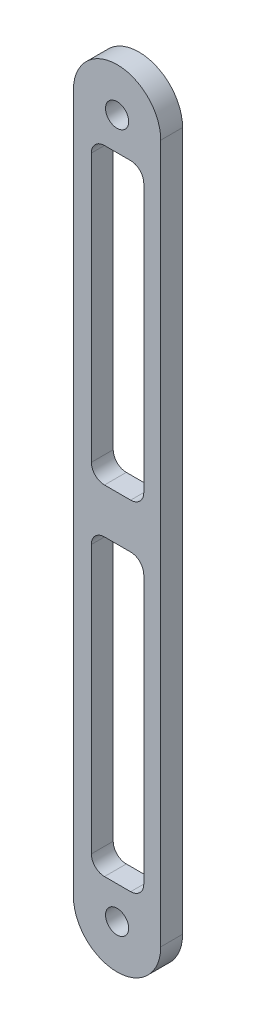
ISO-10303-21;
HEADER;
FILE_DESCRIPTION(('STEP AP214'),'2;1');
FILE_NAME('part.step','',(''),(''),'','','');
FILE_SCHEMA(('AUTOMOTIVE_DESIGN { 1 0 10303 214 1 1 1 1 }'));
ENDSEC;
DATA;
#1=APPLICATION_CONTEXT('core data for automotive mechanical design processes');
#2=APPLICATION_PROTOCOL_DEFINITION('international standard','automotive_design',2000,#1);
#3=PRODUCT_CONTEXT('',#1,'mechanical');
#4=PRODUCT('Part','Part','',(#3));
#5=PRODUCT_RELATED_PRODUCT_CATEGORY('part','',(#4));
#6=PRODUCT_DEFINITION_FORMATION('','',#4);
#7=PRODUCT_DEFINITION_CONTEXT('part definition',#1,'design');
#8=PRODUCT_DEFINITION('design','',#6,#7);
#9=PRODUCT_DEFINITION_SHAPE('','',#8);
#10=(LENGTH_UNIT() NAMED_UNIT(*) SI_UNIT(.MILLI.,.METRE.));
#11=(NAMED_UNIT(*) PLANE_ANGLE_UNIT() SI_UNIT($,.RADIAN.));
#12=(NAMED_UNIT(*) SI_UNIT($,.STERADIAN.) SOLID_ANGLE_UNIT());
#13=UNCERTAINTY_MEASURE_WITH_UNIT(LENGTH_MEASURE(1.E-05),#10,'distance_accuracy_value','');
#14=(GEOMETRIC_REPRESENTATION_CONTEXT(3) GLOBAL_UNCERTAINTY_ASSIGNED_CONTEXT((#13)) GLOBAL_UNIT_ASSIGNED_CONTEXT((#10,
#11,#12)) REPRESENTATION_CONTEXT('',''));
#15=CARTESIAN_POINT('',(0.,0.,0.));
#16=DIRECTION('',(0.,0.,1.));
#17=DIRECTION('',(1.,0.,0.));
#18=AXIS2_PLACEMENT_3D('',#15,#16,#17);
#19=CARTESIAN_POINT('',(0.,-80.,5.));
#20=DIRECTION('',(0.,0.,1.));
#21=DIRECTION('',(1.,0.,0.));
#22=AXIS2_PLACEMENT_3D('',#19,#20,#21);
#23=PLANE('',#22);
#24=CARTESIAN_POINT('',(0.,80.,5.));
#25=DIRECTION('',(0.,0.,1.));
#26=DIRECTION('',(1.,0.,0.));
#27=AXIS2_PLACEMENT_3D('',#24,#25,#26);
#28=CIRCLE('',#27,2.65);
#29=CARTESIAN_POINT('',(2.65,80.,5.));
#30=VERTEX_POINT('',#29);
#31=EDGE_CURVE('E310',#30,#30,#28,.T.);
#32=ORIENTED_EDGE('',*,*,#31,.F.);
#33=EDGE_LOOP('',(#32));
#34=FACE_BOUND('',#33,.T.);
#35=CARTESIAN_POINT('',(0.,-80.,5.));
#36=DIRECTION('',(0.,0.,1.));
#37=DIRECTION('',(1.,0.,0.));
#38=AXIS2_PLACEMENT_3D('',#35,#36,#37);
#39=CIRCLE('',#38,10.);
#40=CARTESIAN_POINT('',(-10.,-80.,5.));
#41=VERTEX_POINT('',#40);
#42=CARTESIAN_POINT('',(10.,-80.,5.));
#43=VERTEX_POINT('',#42);
#44=EDGE_CURVE('E182',#41,#43,#39,.T.);
#45=ORIENTED_EDGE('',*,*,#44,.T.);
#46=DIRECTION('',(0.,1.,0.));
#47=VECTOR('',#46,1.);
#48=CARTESIAN_POINT('',(10.,80.,5.));
#49=LINE('',#48,#47);
#50=CARTESIAN_POINT('',(10.,80.,5.));
#51=VERTEX_POINT('',#50);
#52=EDGE_CURVE('E171',#43,#51,#49,.T.);
#53=ORIENTED_EDGE('',*,*,#52,.T.);
#54=CARTESIAN_POINT('',(0.,80.,5.));
#55=DIRECTION('',(0.,0.,1.));
#56=DIRECTION('',(1.,0.,0.));
#57=AXIS2_PLACEMENT_3D('',#54,#55,#56);
#58=CIRCLE('',#57,10.);
#59=CARTESIAN_POINT('',(-10.,80.,5.));
#60=VERTEX_POINT('',#59);
#61=EDGE_CURVE('E181',#51,#60,#58,.T.);
#62=ORIENTED_EDGE('',*,*,#61,.T.);
#63=DIRECTION('',(0.,-1.,0.));
#64=VECTOR('',#63,1.);
#65=CARTESIAN_POINT('',(-10.,80.,5.));
#66=LINE('',#65,#64);
#67=EDGE_CURVE('E187',#60,#41,#66,.T.);
#68=ORIENTED_EDGE('',*,*,#67,.T.);
#69=EDGE_LOOP('',(#45,#53,#62,#68));
#70=FACE_BOUND('',#69,.T.);
#71=CARTESIAN_POINT('',(0.,-80.,5.));
#72=DIRECTION('',(0.,0.,1.));
#73=DIRECTION('',(1.,0.,0.));
#74=AXIS2_PLACEMENT_3D('',#71,#72,#73);
#75=CIRCLE('',#74,2.65);
#76=CARTESIAN_POINT('',(2.65,-80.,5.));
#77=VERTEX_POINT('',#76);
#78=EDGE_CURVE('E304',#77,#77,#75,.T.);
#79=ORIENTED_EDGE('',*,*,#78,.F.);
#80=EDGE_LOOP('',(#79));
#81=FACE_BOUND('',#80,.T.);
#82=DIRECTION('',(0.,1.,0.));
#83=VECTOR('',#82,1.);
#84=CARTESIAN_POINT('',(6.11196873088894,5.16299536620627,5.));
#85=LINE('',#84,#83);
#86=CARTESIAN_POINT('',(6.11196873088894,8.16299536620627,5.));
#87=VERTEX_POINT('',#86);
#88=CARTESIAN_POINT('',(6.11196873088894,69.5,5.));
#89=VERTEX_POINT('',#88);
#90=EDGE_CURVE('E288',#87,#89,#85,.T.);
#91=ORIENTED_EDGE('',*,*,#90,.F.);
#92=CARTESIAN_POINT('',(3.11196873088894,8.16299536620627,5.));
#93=DIRECTION('',(0.,0.,1.));
#94=DIRECTION('',(1.,0.,0.));
#95=AXIS2_PLACEMENT_3D('',#92,#93,#94);
#96=CIRCLE('',#95,3.);
#97=CARTESIAN_POINT('',(3.11196873088894,5.16299536620627,5.));
#98=VERTEX_POINT('',#97);
#99=EDGE_CURVE('E258',#87,#98,#96,.F.);
#100=ORIENTED_EDGE('',*,*,#99,.T.);
#101=DIRECTION('',(1.,0.,0.));
#102=VECTOR('',#101,1.);
#103=CARTESIAN_POINT('',(6.11196873088894,5.16299536620627,5.));
#104=LINE('',#103,#102);
#105=CARTESIAN_POINT('',(-2.88803126911105,5.16299536620627,5.));
#106=VERTEX_POINT('',#105);
#107=EDGE_CURVE('E282',#106,#98,#104,.T.);
#108=ORIENTED_EDGE('',*,*,#107,.F.);
#109=CARTESIAN_POINT('',(-2.88803126911106,8.16299536620627,5.));
#110=DIRECTION('',(0.,0.,1.));
#111=DIRECTION('',(1.,0.,0.));
#112=AXIS2_PLACEMENT_3D('',#109,#110,#111);
#113=CIRCLE('',#112,3.);
#114=CARTESIAN_POINT('',(-5.88803126911106,8.16299536620627,5.));
#115=VERTEX_POINT('',#114);
#116=EDGE_CURVE('E262',#106,#115,#113,.F.);
#117=ORIENTED_EDGE('',*,*,#116,.T.);
#118=DIRECTION('',(0.,-1.,0.));
#119=VECTOR('',#118,1.);
#120=CARTESIAN_POINT('',(-5.88803126911106,72.5,5.));
#121=LINE('',#120,#119);
#122=CARTESIAN_POINT('',(-5.88803126911106,69.5,5.));
#123=VERTEX_POINT('',#122);
#124=EDGE_CURVE('E287',#123,#115,#121,.T.);
#125=ORIENTED_EDGE('',*,*,#124,.F.);
#126=CARTESIAN_POINT('',(-2.88803126911107,69.5,5.));
#127=DIRECTION('',(0.,0.,1.));
#128=DIRECTION('',(1.,0.,0.));
#129=AXIS2_PLACEMENT_3D('',#126,#127,#128);
#130=CIRCLE('',#129,3.);
#131=CARTESIAN_POINT('',(-2.88803126911107,72.5,5.));
#132=VERTEX_POINT('',#131);
#133=EDGE_CURVE('E11',#123,#132,#130,.F.);
#134=ORIENTED_EDGE('',*,*,#133,.T.);
#135=DIRECTION('',(-1.,0.,0.));
#136=VECTOR('',#135,1.);
#137=CARTESIAN_POINT('',(6.11196873088894,72.5,5.));
#138=LINE('',#137,#136);
#139=CARTESIAN_POINT('',(3.11196873088894,72.5,5.));
#140=VERTEX_POINT('',#139);
#141=EDGE_CURVE('E285',#140,#132,#138,.T.);
#142=ORIENTED_EDGE('',*,*,#141,.F.);
#143=CARTESIAN_POINT('',(3.11196873088894,69.5,5.));
#144=DIRECTION('',(0.,0.,1.));
#145=DIRECTION('',(1.,0.,0.));
#146=AXIS2_PLACEMENT_3D('',#143,#144,#145);
#147=CIRCLE('',#146,3.);
#148=EDGE_CURVE('E266',#140,#89,#147,.F.);
#149=ORIENTED_EDGE('',*,*,#148,.T.);
#150=EDGE_LOOP('',(#91,#100,#108,#117,#125,#134,#142,#149));
#151=FACE_BOUND('',#150,.T.);
#152=DIRECTION('',(1.,0.,0.));
#153=VECTOR('',#152,1.);
#154=CARTESIAN_POINT('',(6.11196873088894,-72.5,5.));
#155=LINE('',#154,#153);
#156=CARTESIAN_POINT('',(-2.88803126911105,-72.5,5.));
#157=VERTEX_POINT('',#156);
#158=CARTESIAN_POINT('',(3.11196873088894,-72.5,5.));
#159=VERTEX_POINT('',#158);
#160=EDGE_CURVE('E416',#157,#159,#155,.T.);
#161=ORIENTED_EDGE('',*,*,#160,.F.);
#162=CARTESIAN_POINT('',(-2.88803126911105,-69.5,5.));
#163=DIRECTION('',(0.,0.,1.));
#164=DIRECTION('',(1.,0.,0.));
#165=AXIS2_PLACEMENT_3D('',#162,#163,#164);
#166=CIRCLE('',#165,3.);
#167=CARTESIAN_POINT('',(-5.88803126911105,-69.5,5.));
#168=VERTEX_POINT('',#167);
#169=EDGE_CURVE('E242',#157,#168,#166,.F.);
#170=ORIENTED_EDGE('',*,*,#169,.T.);
#171=DIRECTION('',(0.,-1.,0.));
#172=VECTOR('',#171,1.);
#173=CARTESIAN_POINT('',(-5.88803126911106,-5.13716936276521,5.));
#174=LINE('',#173,#172);
#175=CARTESIAN_POINT('',(-5.88803126911106,-8.13716936276522,5.));
#176=VERTEX_POINT('',#175);
#177=EDGE_CURVE('E400',#176,#168,#174,.T.);
#178=ORIENTED_EDGE('',*,*,#177,.F.);
#179=CARTESIAN_POINT('',(-2.88803126911105,-8.13716936276522,5.));
#180=DIRECTION('',(0.,0.,1.));
#181=DIRECTION('',(1.,0.,0.));
#182=AXIS2_PLACEMENT_3D('',#179,#180,#181);
#183=CIRCLE('',#182,3.);
#184=CARTESIAN_POINT('',(-2.88803126911105,-5.13716936276521,5.));
#185=VERTEX_POINT('',#184);
#186=EDGE_CURVE('E254',#176,#185,#183,.F.);
#187=ORIENTED_EDGE('',*,*,#186,.T.);
#188=DIRECTION('',(-1.,0.,0.));
#189=VECTOR('',#188,1.);
#190=CARTESIAN_POINT('',(6.11196873088894,-5.13716936276521,5.));
#191=LINE('',#190,#189);
#192=CARTESIAN_POINT('',(3.11196873088894,-5.13716936276521,5.));
#193=VERTEX_POINT('',#192);
#194=EDGE_CURVE('E300',#193,#185,#191,.T.);
#195=ORIENTED_EDGE('',*,*,#194,.F.);
#196=CARTESIAN_POINT('',(3.11196873088894,-8.13716936276522,5.));
#197=DIRECTION('',(0.,0.,1.));
#198=DIRECTION('',(1.,0.,0.));
#199=AXIS2_PLACEMENT_3D('',#196,#197,#198);
#200=CIRCLE('',#199,3.);
#201=CARTESIAN_POINT('',(6.11196873088894,-8.13716936276522,5.));
#202=VERTEX_POINT('',#201);
#203=EDGE_CURVE('E250',#193,#202,#200,.F.);
#204=ORIENTED_EDGE('',*,*,#203,.T.);
#205=DIRECTION('',(0.,1.,0.));
#206=VECTOR('',#205,1.);
#207=CARTESIAN_POINT('',(6.11196873088894,-72.5,5.));
#208=LINE('',#207,#206);
#209=CARTESIAN_POINT('',(6.11196873088894,-69.5,5.));
#210=VERTEX_POINT('',#209);
#211=EDGE_CURVE('E411',#210,#202,#208,.T.);
#212=ORIENTED_EDGE('',*,*,#211,.F.);
#213=CARTESIAN_POINT('',(3.11196873088894,-69.5,5.));
#214=DIRECTION('',(0.,0.,1.));
#215=DIRECTION('',(1.,0.,0.));
#216=AXIS2_PLACEMENT_3D('',#213,#214,#215);
#217=CIRCLE('',#216,3.);
#218=EDGE_CURVE('E246',#210,#159,#217,.F.);
#219=ORIENTED_EDGE('',*,*,#218,.T.);
#220=EDGE_LOOP('',(#161,#170,#178,#187,#195,#204,#212,#219));
#221=FACE_BOUND('',#220,.T.);
#222=ADVANCED_FACE('F34',(#34,#70,#81,#151,#221),#23,.T.);
#223=CARTESIAN_POINT('',(0.,-80.,0.));
#224=DIRECTION('',(0.,0.,1.));
#225=DIRECTION('',(1.,0.,0.));
#226=AXIS2_PLACEMENT_3D('',#223,#224,#225);
#227=PLANE('',#226);
#228=DIRECTION('',(0.,-1.,0.));
#229=VECTOR('',#228,1.);
#230=CARTESIAN_POINT('',(-5.88803126911106,72.5,0.));
#231=LINE('',#230,#229);
#232=CARTESIAN_POINT('',(-5.88803126911106,69.5,0.));
#233=VERTEX_POINT('',#232);
#234=CARTESIAN_POINT('',(-5.88803126911106,8.16299536620627,0.));
#235=VERTEX_POINT('',#234);
#236=EDGE_CURVE('E273',#233,#235,#231,.T.);
#237=ORIENTED_EDGE('',*,*,#236,.T.);
#238=CARTESIAN_POINT('',(-2.88803126911106,8.16299536620627,0.));
#239=DIRECTION('',(0.,0.,1.));
#240=DIRECTION('',(1.,0.,0.));
#241=AXIS2_PLACEMENT_3D('',#238,#239,#240);
#242=CIRCLE('',#241,3.);
#243=CARTESIAN_POINT('',(-2.88803126911105,5.16299536620627,0.));
#244=VERTEX_POINT('',#243);
#245=EDGE_CURVE('E260',#235,#244,#242,.T.);
#246=ORIENTED_EDGE('',*,*,#245,.T.);
#247=DIRECTION('',(1.,0.,0.));
#248=VECTOR('',#247,1.);
#249=CARTESIAN_POINT('',(6.11196873088894,5.16299536620627,0.));
#250=LINE('',#249,#248);
#251=CARTESIAN_POINT('',(3.11196873088894,5.16299536620627,0.));
#252=VERTEX_POINT('',#251);
#253=EDGE_CURVE('E296',#244,#252,#250,.T.);
#254=ORIENTED_EDGE('',*,*,#253,.T.);
#255=CARTESIAN_POINT('',(3.11196873088894,8.16299536620627,0.));
#256=DIRECTION('',(0.,0.,1.));
#257=DIRECTION('',(1.,0.,0.));
#258=AXIS2_PLACEMENT_3D('',#255,#256,#257);
#259=CIRCLE('',#258,3.);
#260=CARTESIAN_POINT('',(6.11196873088894,8.16299536620627,0.));
#261=VERTEX_POINT('',#260);
#262=EDGE_CURVE('E256',#252,#261,#259,.T.);
#263=ORIENTED_EDGE('',*,*,#262,.T.);
#264=DIRECTION('',(0.,1.,0.));
#265=VECTOR('',#264,1.);
#266=CARTESIAN_POINT('',(6.11196873088894,5.16299536620627,0.));
#267=LINE('',#266,#265);
#268=CARTESIAN_POINT('',(6.11196873088894,69.5,0.));
#269=VERTEX_POINT('',#268);
#270=EDGE_CURVE('E299',#261,#269,#267,.T.);
#271=ORIENTED_EDGE('',*,*,#270,.T.);
#272=CARTESIAN_POINT('',(3.11196873088894,69.5,0.));
#273=DIRECTION('',(0.,0.,1.));
#274=DIRECTION('',(1.,0.,0.));
#275=AXIS2_PLACEMENT_3D('',#272,#273,#274);
#276=CIRCLE('',#275,3.);
#277=CARTESIAN_POINT('',(3.11196873088894,72.5,0.));
#278=VERTEX_POINT('',#277);
#279=EDGE_CURVE('E264',#269,#278,#276,.T.);
#280=ORIENTED_EDGE('',*,*,#279,.T.);
#281=DIRECTION('',(-1.,0.,0.));
#282=VECTOR('',#281,1.);
#283=CARTESIAN_POINT('',(6.11196873088894,72.5,0.));
#284=LINE('',#283,#282);
#285=CARTESIAN_POINT('',(-2.88803126911107,72.5,0.));
#286=VERTEX_POINT('',#285);
#287=EDGE_CURVE('E274',#278,#286,#284,.T.);
#288=ORIENTED_EDGE('',*,*,#287,.T.);
#289=CARTESIAN_POINT('',(-2.88803126911107,69.5,0.));
#290=DIRECTION('',(0.,0.,1.));
#291=DIRECTION('',(1.,0.,0.));
#292=AXIS2_PLACEMENT_3D('',#289,#290,#291);
#293=CIRCLE('',#292,3.);
#294=EDGE_CURVE('E42',#286,#233,#293,.T.);
#295=ORIENTED_EDGE('',*,*,#294,.T.);
#296=EDGE_LOOP('',(#237,#246,#254,#263,#271,#280,#288,#295));
#297=FACE_BOUND('',#296,.T.);
#298=CARTESIAN_POINT('',(0.,-80.,0.));
#299=DIRECTION('',(0.,0.,1.));
#300=DIRECTION('',(1.,0.,0.));
#301=AXIS2_PLACEMENT_3D('',#298,#299,#300);
#302=CIRCLE('',#301,10.);
#303=CARTESIAN_POINT('',(-10.,-80.,0.));
#304=VERTEX_POINT('',#303);
#305=CARTESIAN_POINT('',(10.,-80.,0.));
#306=VERTEX_POINT('',#305);
#307=EDGE_CURVE('E195',#304,#306,#302,.T.);
#308=ORIENTED_EDGE('',*,*,#307,.F.);
#309=DIRECTION('',(0.,-1.,0.));
#310=VECTOR('',#309,1.);
#311=CARTESIAN_POINT('',(-10.,80.,0.));
#312=LINE('',#311,#310);
#313=CARTESIAN_POINT('',(-10.,80.,0.));
#314=VERTEX_POINT('',#313);
#315=EDGE_CURVE('E191',#314,#304,#312,.T.);
#316=ORIENTED_EDGE('',*,*,#315,.F.);
#317=CARTESIAN_POINT('',(0.,80.,0.));
#318=DIRECTION('',(0.,0.,1.));
#319=DIRECTION('',(1.,0.,0.));
#320=AXIS2_PLACEMENT_3D('',#317,#318,#319);
#321=CIRCLE('',#320,10.);
#322=CARTESIAN_POINT('',(10.,80.,0.));
#323=VERTEX_POINT('',#322);
#324=EDGE_CURVE('E321',#323,#314,#321,.T.);
#325=ORIENTED_EDGE('',*,*,#324,.F.);
#326=DIRECTION('',(0.,1.,0.));
#327=VECTOR('',#326,1.);
#328=CARTESIAN_POINT('',(10.,80.,0.));
#329=LINE('',#328,#327);
#330=EDGE_CURVE('E319',#306,#323,#329,.T.);
#331=ORIENTED_EDGE('',*,*,#330,.F.);
#332=EDGE_LOOP('',(#308,#316,#325,#331));
#333=FACE_BOUND('',#332,.T.);
#334=CARTESIAN_POINT('',(0.,80.,0.));
#335=DIRECTION('',(0.,0.,1.));
#336=DIRECTION('',(1.,0.,0.));
#337=AXIS2_PLACEMENT_3D('',#334,#335,#336);
#338=CIRCLE('',#337,2.65);
#339=CARTESIAN_POINT('',(2.65,80.,0.));
#340=VERTEX_POINT('',#339);
#341=EDGE_CURVE('E307',#340,#340,#338,.T.);
#342=ORIENTED_EDGE('',*,*,#341,.T.);
#343=EDGE_LOOP('',(#342));
#344=FACE_BOUND('',#343,.T.);
#345=CARTESIAN_POINT('',(0.,-80.,0.));
#346=DIRECTION('',(0.,0.,1.));
#347=DIRECTION('',(1.,0.,0.));
#348=AXIS2_PLACEMENT_3D('',#345,#346,#347);
#349=CIRCLE('',#348,2.65);
#350=CARTESIAN_POINT('',(2.65,-80.,0.));
#351=VERTEX_POINT('',#350);
#352=EDGE_CURVE('E290',#351,#351,#349,.T.);
#353=ORIENTED_EDGE('',*,*,#352,.T.);
#354=EDGE_LOOP('',(#353));
#355=FACE_BOUND('',#354,.T.);
#356=DIRECTION('',(-1.,0.,0.));
#357=VECTOR('',#356,1.);
#358=CARTESIAN_POINT('',(6.11196873088894,-5.13716936276521,0.));
#359=LINE('',#358,#357);
#360=CARTESIAN_POINT('',(3.11196873088894,-5.13716936276521,0.));
#361=VERTEX_POINT('',#360);
#362=CARTESIAN_POINT('',(-2.88803126911105,-5.13716936276521,0.));
#363=VERTEX_POINT('',#362);
#364=EDGE_CURVE('E394',#361,#363,#359,.T.);
#365=ORIENTED_EDGE('',*,*,#364,.T.);
#366=CARTESIAN_POINT('',(-2.88803126911105,-8.13716936276522,0.));
#367=DIRECTION('',(0.,0.,1.));
#368=DIRECTION('',(1.,0.,0.));
#369=AXIS2_PLACEMENT_3D('',#366,#367,#368);
#370=CIRCLE('',#369,3.);
#371=CARTESIAN_POINT('',(-5.88803126911106,-8.13716936276522,0.));
#372=VERTEX_POINT('',#371);
#373=EDGE_CURVE('E252',#363,#372,#370,.T.);
#374=ORIENTED_EDGE('',*,*,#373,.T.);
#375=DIRECTION('',(0.,-1.,0.));
#376=VECTOR('',#375,1.);
#377=CARTESIAN_POINT('',(-5.88803126911106,-5.13716936276521,0.));
#378=LINE('',#377,#376);
#379=CARTESIAN_POINT('',(-5.88803126911105,-69.5,0.));
#380=VERTEX_POINT('',#379);
#381=EDGE_CURVE('E423',#372,#380,#378,.T.);
#382=ORIENTED_EDGE('',*,*,#381,.T.);
#383=CARTESIAN_POINT('',(-2.88803126911105,-69.5,0.));
#384=DIRECTION('',(0.,0.,1.));
#385=DIRECTION('',(1.,0.,0.));
#386=AXIS2_PLACEMENT_3D('',#383,#384,#385);
#387=CIRCLE('',#386,3.);
#388=CARTESIAN_POINT('',(-2.88803126911105,-72.5,0.));
#389=VERTEX_POINT('',#388);
#390=EDGE_CURVE('E240',#380,#389,#387,.T.);
#391=ORIENTED_EDGE('',*,*,#390,.T.);
#392=DIRECTION('',(1.,0.,0.));
#393=VECTOR('',#392,1.);
#394=CARTESIAN_POINT('',(6.11196873088894,-72.5,0.));
#395=LINE('',#394,#393);
#396=CARTESIAN_POINT('',(3.11196873088894,-72.5,0.));
#397=VERTEX_POINT('',#396);
#398=EDGE_CURVE('E426',#389,#397,#395,.T.);
#399=ORIENTED_EDGE('',*,*,#398,.T.);
#400=CARTESIAN_POINT('',(3.11196873088894,-69.5,0.));
#401=DIRECTION('',(0.,0.,1.));
#402=DIRECTION('',(1.,0.,0.));
#403=AXIS2_PLACEMENT_3D('',#400,#401,#402);
#404=CIRCLE('',#403,3.);
#405=CARTESIAN_POINT('',(6.11196873088894,-69.5,0.));
#406=VERTEX_POINT('',#405);
#407=EDGE_CURVE('E244',#397,#406,#404,.T.);
#408=ORIENTED_EDGE('',*,*,#407,.T.);
#409=DIRECTION('',(0.,1.,0.));
#410=VECTOR('',#409,1.);
#411=CARTESIAN_POINT('',(6.11196873088894,-72.5,0.));
#412=LINE('',#411,#410);
#413=CARTESIAN_POINT('',(6.11196873088894,-8.13716936276522,0.));
#414=VERTEX_POINT('',#413);
#415=EDGE_CURVE('E401',#406,#414,#412,.T.);
#416=ORIENTED_EDGE('',*,*,#415,.T.);
#417=CARTESIAN_POINT('',(3.11196873088894,-8.13716936276522,0.));
#418=DIRECTION('',(0.,0.,1.));
#419=DIRECTION('',(1.,0.,0.));
#420=AXIS2_PLACEMENT_3D('',#417,#418,#419);
#421=CIRCLE('',#420,3.);
#422=EDGE_CURVE('E248',#414,#361,#421,.T.);
#423=ORIENTED_EDGE('',*,*,#422,.T.);
#424=EDGE_LOOP('',(#365,#374,#382,#391,#399,#408,#416,#423));
#425=FACE_BOUND('',#424,.T.);
#426=ADVANCED_FACE('F271',(#297,#333,#344,#355,#425),#227,.F.);
#427=CARTESIAN_POINT('',(0.,-80.,5.));
#428=DIRECTION('',(0.,0.,-1.));
#429=DIRECTION('',(-1.,0.,0.));
#430=AXIS2_PLACEMENT_3D('',#427,#428,#429);
#431=CYLINDRICAL_SURFACE('',#430,10.);
#432=ORIENTED_EDGE('',*,*,#307,.T.);
#433=DIRECTION('',(0.,0.,-1.));
#434=VECTOR('',#433,1.);
#435=CARTESIAN_POINT('',(10.,-80.,5.));
#436=LINE('',#435,#434);
#437=EDGE_CURVE('E175',#43,#306,#436,.T.);
#438=ORIENTED_EDGE('',*,*,#437,.F.);
#439=ORIENTED_EDGE('',*,*,#44,.F.);
#440=DIRECTION('',(0.,0.,-1.));
#441=VECTOR('',#440,1.);
#442=CARTESIAN_POINT('',(-10.,-80.,5.));
#443=LINE('',#442,#441);
#444=EDGE_CURVE('E317',#41,#304,#443,.T.);
#445=ORIENTED_EDGE('',*,*,#444,.T.);
#446=EDGE_LOOP('',(#432,#438,#439,#445));
#447=FACE_BOUND('',#446,.T.);
#448=ADVANCED_FACE('F193',(#447),#431,.T.);
#449=CARTESIAN_POINT('',(10.,80.,5.));
#450=DIRECTION('',(-1.,0.,0.));
#451=DIRECTION('',(0.,0.,1.));
#452=AXIS2_PLACEMENT_3D('',#449,#450,#451);
#453=PLANE('',#452);
#454=ORIENTED_EDGE('',*,*,#330,.T.);
#455=DIRECTION('',(0.,0.,-1.));
#456=VECTOR('',#455,1.);
#457=CARTESIAN_POINT('',(10.,80.,5.));
#458=LINE('',#457,#456);
#459=EDGE_CURVE('E178',#51,#323,#458,.T.);
#460=ORIENTED_EDGE('',*,*,#459,.F.);
#461=ORIENTED_EDGE('',*,*,#52,.F.);
#462=ORIENTED_EDGE('',*,*,#437,.T.);
#463=EDGE_LOOP('',(#454,#460,#461,#462));
#464=FACE_BOUND('',#463,.T.);
#465=ADVANCED_FACE('F173',(#464),#453,.F.);
#466=CARTESIAN_POINT('',(0.,80.,5.));
#467=DIRECTION('',(0.,0.,-1.));
#468=DIRECTION('',(-1.,0.,0.));
#469=AXIS2_PLACEMENT_3D('',#466,#467,#468);
#470=CYLINDRICAL_SURFACE('',#469,10.);
#471=ORIENTED_EDGE('',*,*,#324,.T.);
#472=DIRECTION('',(0.,0.,-1.));
#473=VECTOR('',#472,1.);
#474=CARTESIAN_POINT('',(-10.,80.,5.));
#475=LINE('',#474,#473);
#476=EDGE_CURVE('E200',#60,#314,#475,.T.);
#477=ORIENTED_EDGE('',*,*,#476,.F.);
#478=ORIENTED_EDGE('',*,*,#61,.F.);
#479=ORIENTED_EDGE('',*,*,#459,.T.);
#480=EDGE_LOOP('',(#471,#477,#478,#479));
#481=FACE_BOUND('',#480,.T.);
#482=ADVANCED_FACE('F332',(#481),#470,.T.);
#483=CARTESIAN_POINT('',(-10.,80.,5.));
#484=DIRECTION('',(1.,0.,0.));
#485=DIRECTION('',(0.,0.,-1.));
#486=AXIS2_PLACEMENT_3D('',#483,#484,#485);
#487=PLANE('',#486);
#488=ORIENTED_EDGE('',*,*,#315,.T.);
#489=ORIENTED_EDGE('',*,*,#444,.F.);
#490=ORIENTED_EDGE('',*,*,#67,.F.);
#491=ORIENTED_EDGE('',*,*,#476,.T.);
#492=EDGE_LOOP('',(#488,#489,#490,#491));
#493=FACE_BOUND('',#492,.T.);
#494=ADVANCED_FACE('F328',(#493),#487,.F.);
#495=CARTESIAN_POINT('',(0.,80.,5.));
#496=DIRECTION('',(0.,0.,-1.));
#497=DIRECTION('',(-1.,0.,0.));
#498=AXIS2_PLACEMENT_3D('',#495,#496,#497);
#499=CYLINDRICAL_SURFACE('',#498,2.65);
#500=ORIENTED_EDGE('',*,*,#31,.T.);
#501=EDGE_LOOP('',(#500));
#502=FACE_BOUND('',#501,.T.);
#503=ORIENTED_EDGE('',*,*,#341,.F.);
#504=EDGE_LOOP('',(#503));
#505=FACE_BOUND('',#504,.T.);
#506=ADVANCED_FACE('F339',(#502,#505),#499,.F.);
#507=CARTESIAN_POINT('',(0.,-80.,5.));
#508=DIRECTION('',(0.,0.,-1.));
#509=DIRECTION('',(-1.,0.,0.));
#510=AXIS2_PLACEMENT_3D('',#507,#508,#509);
#511=CYLINDRICAL_SURFACE('',#510,2.65);
#512=ORIENTED_EDGE('',*,*,#78,.T.);
#513=EDGE_LOOP('',(#512));
#514=FACE_BOUND('',#513,.T.);
#515=ORIENTED_EDGE('',*,*,#352,.F.);
#516=EDGE_LOOP('',(#515));
#517=FACE_BOUND('',#516,.T.);
#518=ADVANCED_FACE('F353',(#514,#517),#511,.F.);
#519=CARTESIAN_POINT('',(6.11196873088894,5.16299536620627,5.));
#520=DIRECTION('',(0.,1.,0.));
#521=DIRECTION('',(-1.,0.,0.));
#522=AXIS2_PLACEMENT_3D('',#519,#520,#521);
#523=PLANE('',#522);
#524=ORIENTED_EDGE('',*,*,#107,.T.);
#525=DIRECTION('',(0.,0.,-1.));
#526=VECTOR('',#525,1.);
#527=CARTESIAN_POINT('',(3.11196873088894,5.16299536620627,0.));
#528=LINE('',#527,#526);
#529=EDGE_CURVE('E223',#98,#252,#528,.T.);
#530=ORIENTED_EDGE('',*,*,#529,.T.);
#531=ORIENTED_EDGE('',*,*,#253,.F.);
#532=DIRECTION('',(0.,0.,-1.));
#533=VECTOR('',#532,1.);
#534=CARTESIAN_POINT('',(-2.88803126911106,5.16299536620627,5.));
#535=LINE('',#534,#533);
#536=EDGE_CURVE('E221',#244,#106,#535,.F.);
#537=ORIENTED_EDGE('',*,*,#536,.T.);
#538=EDGE_LOOP('',(#524,#530,#531,#537));
#539=FACE_BOUND('',#538,.T.);
#540=ADVANCED_FACE('F357',(#539),#523,.T.);
#541=CARTESIAN_POINT('',(6.11196873088894,5.16299536620627,5.));
#542=DIRECTION('',(-1.,0.,0.));
#543=DIRECTION('',(0.,0.,1.));
#544=AXIS2_PLACEMENT_3D('',#541,#542,#543);
#545=PLANE('',#544);
#546=ORIENTED_EDGE('',*,*,#270,.F.);
#547=DIRECTION('',(0.,0.,-1.));
#548=VECTOR('',#547,1.);
#549=CARTESIAN_POINT('',(6.11196873088894,8.16299536620627,5.));
#550=LINE('',#549,#548);
#551=EDGE_CURVE('E229',#261,#87,#550,.F.);
#552=ORIENTED_EDGE('',*,*,#551,.T.);
#553=ORIENTED_EDGE('',*,*,#90,.T.);
#554=DIRECTION('',(0.,0.,-1.));
#555=VECTOR('',#554,1.);
#556=CARTESIAN_POINT('',(6.11196873088894,69.5,0.));
#557=LINE('',#556,#555);
#558=EDGE_CURVE('E226',#89,#269,#557,.T.);
#559=ORIENTED_EDGE('',*,*,#558,.T.);
#560=EDGE_LOOP('',(#546,#552,#553,#559));
#561=FACE_BOUND('',#560,.T.);
#562=ADVANCED_FACE('F361',(#561),#545,.T.);
#563=CARTESIAN_POINT('',(6.11196873088894,72.5,5.));
#564=DIRECTION('',(0.,-1.,0.));
#565=DIRECTION('',(0.,0.,-1.));
#566=AXIS2_PLACEMENT_3D('',#563,#564,#565);
#567=PLANE('',#566);
#568=ORIENTED_EDGE('',*,*,#287,.F.);
#569=DIRECTION('',(0.,0.,-1.));
#570=VECTOR('',#569,1.);
#571=CARTESIAN_POINT('',(3.11196873088894,72.5,5.));
#572=LINE('',#571,#570);
#573=EDGE_CURVE('E54',#278,#140,#572,.F.);
#574=ORIENTED_EDGE('',*,*,#573,.T.);
#575=ORIENTED_EDGE('',*,*,#141,.T.);
#576=DIRECTION('',(0.,0.,-1.));
#577=VECTOR('',#576,1.);
#578=CARTESIAN_POINT('',(-2.88803126911107,72.5,0.));
#579=LINE('',#578,#577);
#580=EDGE_CURVE('E236',#132,#286,#579,.T.);
#581=ORIENTED_EDGE('',*,*,#580,.T.);
#582=EDGE_LOOP('',(#568,#574,#575,#581));
#583=FACE_BOUND('',#582,.T.);
#584=ADVANCED_FACE('F284',(#583),#567,.T.);
#585=CARTESIAN_POINT('',(-5.88803126911106,72.5,5.));
#586=DIRECTION('',(1.,0.,0.));
#587=DIRECTION('',(0.,1.,0.));
#588=AXIS2_PLACEMENT_3D('',#585,#586,#587);
#589=PLANE('',#588);
#590=ORIENTED_EDGE('',*,*,#124,.T.);
#591=DIRECTION('',(0.,0.,-1.));
#592=VECTOR('',#591,1.);
#593=CARTESIAN_POINT('',(-5.88803126911106,8.16299536620627,0.));
#594=LINE('',#593,#592);
#595=EDGE_CURVE('E233',#115,#235,#594,.T.);
#596=ORIENTED_EDGE('',*,*,#595,.T.);
#597=ORIENTED_EDGE('',*,*,#236,.F.);
#598=DIRECTION('',(0.,0.,-1.));
#599=VECTOR('',#598,1.);
#600=CARTESIAN_POINT('',(-5.88803126911106,69.5,5.));
#601=LINE('',#600,#599);
#602=EDGE_CURVE('E231',#233,#123,#601,.F.);
#603=ORIENTED_EDGE('',*,*,#602,.T.);
#604=EDGE_LOOP('',(#590,#596,#597,#603));
#605=FACE_BOUND('',#604,.T.);
#606=ADVANCED_FACE('F280',(#605),#589,.T.);
#607=CARTESIAN_POINT('',(-5.88803126911106,-5.13716936276521,5.));
#608=DIRECTION('',(1.,0.,0.));
#609=DIRECTION('',(0.,1.,0.));
#610=AXIS2_PLACEMENT_3D('',#607,#608,#609);
#611=PLANE('',#610);
#612=ORIENTED_EDGE('',*,*,#177,.T.);
#613=DIRECTION('',(0.,0.,-1.));
#614=VECTOR('',#613,1.);
#615=CARTESIAN_POINT('',(-5.88803126911105,-69.5,0.));
#616=LINE('',#615,#614);
#617=EDGE_CURVE('E198',#168,#380,#616,.T.);
#618=ORIENTED_EDGE('',*,*,#617,.T.);
#619=ORIENTED_EDGE('',*,*,#381,.F.);
#620=DIRECTION('',(0.,0.,-1.));
#621=VECTOR('',#620,1.);
#622=CARTESIAN_POINT('',(-5.88803126911106,-8.13716936276522,5.));
#623=LINE('',#622,#621);
#624=EDGE_CURVE('E196',#372,#176,#623,.F.);
#625=ORIENTED_EDGE('',*,*,#624,.T.);
#626=EDGE_LOOP('',(#612,#618,#619,#625));
#627=FACE_BOUND('',#626,.T.);
#628=ADVANCED_FACE('F370',(#627),#611,.T.);
#629=CARTESIAN_POINT('',(6.11196873088894,-72.5,5.));
#630=DIRECTION('',(0.,1.,0.));
#631=DIRECTION('',(0.,0.,1.));
#632=AXIS2_PLACEMENT_3D('',#629,#630,#631);
#633=PLANE('',#632);
#634=ORIENTED_EDGE('',*,*,#398,.F.);
#635=DIRECTION('',(0.,0.,-1.));
#636=VECTOR('',#635,1.);
#637=CARTESIAN_POINT('',(-2.88803126911105,-72.5,5.));
#638=LINE('',#637,#636);
#639=EDGE_CURVE('E209',#389,#157,#638,.F.);
#640=ORIENTED_EDGE('',*,*,#639,.T.);
#641=ORIENTED_EDGE('',*,*,#160,.T.);
#642=DIRECTION('',(0.,0.,-1.));
#643=VECTOR('',#642,1.);
#644=CARTESIAN_POINT('',(3.11196873088894,-72.5,0.));
#645=LINE('',#644,#643);
#646=EDGE_CURVE('E206',#159,#397,#645,.T.);
#647=ORIENTED_EDGE('',*,*,#646,.T.);
#648=EDGE_LOOP('',(#634,#640,#641,#647));
#649=FACE_BOUND('',#648,.T.);
#650=ADVANCED_FACE('F373',(#649),#633,.T.);
#651=CARTESIAN_POINT('',(6.11196873088894,-72.5,5.));
#652=DIRECTION('',(-1.,0.,0.));
#653=DIRECTION('',(0.,0.,1.));
#654=AXIS2_PLACEMENT_3D('',#651,#652,#653);
#655=PLANE('',#654);
#656=ORIENTED_EDGE('',*,*,#415,.F.);
#657=DIRECTION('',(0.,0.,-1.));
#658=VECTOR('',#657,1.);
#659=CARTESIAN_POINT('',(6.11196873088894,-69.5,5.));
#660=LINE('',#659,#658);
#661=EDGE_CURVE('E214',#406,#210,#660,.F.);
#662=ORIENTED_EDGE('',*,*,#661,.T.);
#663=ORIENTED_EDGE('',*,*,#211,.T.);
#664=DIRECTION('',(0.,0.,-1.));
#665=VECTOR('',#664,1.);
#666=CARTESIAN_POINT('',(6.11196873088894,-8.13716936276522,0.));
#667=LINE('',#666,#665);
#668=EDGE_CURVE('E211',#202,#414,#667,.T.);
#669=ORIENTED_EDGE('',*,*,#668,.T.);
#670=EDGE_LOOP('',(#656,#662,#663,#669));
#671=FACE_BOUND('',#670,.T.);
#672=ADVANCED_FACE('F377',(#671),#655,.T.);
#673=CARTESIAN_POINT('',(6.11196873088894,-5.13716936276521,5.));
#674=DIRECTION('',(0.,-1.,0.));
#675=DIRECTION('',(1.,0.,0.));
#676=AXIS2_PLACEMENT_3D('',#673,#674,#675);
#677=PLANE('',#676);
#678=ORIENTED_EDGE('',*,*,#364,.F.);
#679=DIRECTION('',(0.,0.,-1.));
#680=VECTOR('',#679,1.);
#681=CARTESIAN_POINT('',(3.11196873088894,-5.13716936276521,5.));
#682=LINE('',#681,#680);
#683=EDGE_CURVE('E219',#361,#193,#682,.F.);
#684=ORIENTED_EDGE('',*,*,#683,.T.);
#685=ORIENTED_EDGE('',*,*,#194,.T.);
#686=DIRECTION('',(0.,0.,-1.));
#687=VECTOR('',#686,1.);
#688=CARTESIAN_POINT('',(-2.88803126911105,-5.13716936276521,0.));
#689=LINE('',#688,#687);
#690=EDGE_CURVE('E216',#185,#363,#689,.T.);
#691=ORIENTED_EDGE('',*,*,#690,.T.);
#692=EDGE_LOOP('',(#678,#684,#685,#691));
#693=FACE_BOUND('',#692,.T.);
#694=ADVANCED_FACE('F381',(#693),#677,.T.);
#695=CARTESIAN_POINT('',(-2.88803126911105,-69.5,5.));
#696=DIRECTION('',(0.,0.,1.));
#697=DIRECTION('',(1.,0.,0.));
#698=AXIS2_PLACEMENT_3D('',#695,#696,#697);
#699=CYLINDRICAL_SURFACE('',#698,3.);
#700=ORIENTED_EDGE('',*,*,#169,.F.);
#701=ORIENTED_EDGE('',*,*,#639,.F.);
#702=ORIENTED_EDGE('',*,*,#390,.F.);
#703=ORIENTED_EDGE('',*,*,#617,.F.);
#704=EDGE_LOOP('',(#700,#701,#702,#703));
#705=FACE_BOUND('',#704,.T.);
#706=ADVANCED_FACE('F384',(#705),#699,.F.);
#707=CARTESIAN_POINT('',(3.11196873088894,-69.5,5.));
#708=DIRECTION('',(0.,0.,1.));
#709=DIRECTION('',(1.,0.,0.));
#710=AXIS2_PLACEMENT_3D('',#707,#708,#709);
#711=CYLINDRICAL_SURFACE('',#710,3.);
#712=ORIENTED_EDGE('',*,*,#218,.F.);
#713=ORIENTED_EDGE('',*,*,#661,.F.);
#714=ORIENTED_EDGE('',*,*,#407,.F.);
#715=ORIENTED_EDGE('',*,*,#646,.F.);
#716=EDGE_LOOP('',(#712,#713,#714,#715));
#717=FACE_BOUND('',#716,.T.);
#718=ADVANCED_FACE('F389',(#717),#711,.F.);
#719=CARTESIAN_POINT('',(3.11196873088894,-8.13716936276522,5.));
#720=DIRECTION('',(0.,0.,1.));
#721=DIRECTION('',(1.,0.,0.));
#722=AXIS2_PLACEMENT_3D('',#719,#720,#721);
#723=CYLINDRICAL_SURFACE('',#722,3.);
#724=ORIENTED_EDGE('',*,*,#203,.F.);
#725=ORIENTED_EDGE('',*,*,#683,.F.);
#726=ORIENTED_EDGE('',*,*,#422,.F.);
#727=ORIENTED_EDGE('',*,*,#668,.F.);
#728=EDGE_LOOP('',(#724,#725,#726,#727));
#729=FACE_BOUND('',#728,.T.);
#730=ADVANCED_FACE('F405',(#729),#723,.F.);
#731=CARTESIAN_POINT('',(-2.88803126911105,-8.13716936276522,5.));
#732=DIRECTION('',(0.,0.,1.));
#733=DIRECTION('',(1.,0.,0.));
#734=AXIS2_PLACEMENT_3D('',#731,#732,#733);
#735=CYLINDRICAL_SURFACE('',#734,3.);
#736=ORIENTED_EDGE('',*,*,#186,.F.);
#737=ORIENTED_EDGE('',*,*,#624,.F.);
#738=ORIENTED_EDGE('',*,*,#373,.F.);
#739=ORIENTED_EDGE('',*,*,#690,.F.);
#740=EDGE_LOOP('',(#736,#737,#738,#739));
#741=FACE_BOUND('',#740,.T.);
#742=ADVANCED_FACE('F455',(#741),#735,.F.);
#743=CARTESIAN_POINT('',(3.11196873088894,8.16299536620627,5.));
#744=DIRECTION('',(0.,0.,1.));
#745=DIRECTION('',(1.,0.,0.));
#746=AXIS2_PLACEMENT_3D('',#743,#744,#745);
#747=CYLINDRICAL_SURFACE('',#746,3.);
#748=ORIENTED_EDGE('',*,*,#99,.F.);
#749=ORIENTED_EDGE('',*,*,#551,.F.);
#750=ORIENTED_EDGE('',*,*,#262,.F.);
#751=ORIENTED_EDGE('',*,*,#529,.F.);
#752=EDGE_LOOP('',(#748,#749,#750,#751));
#753=FACE_BOUND('',#752,.T.);
#754=ADVANCED_FACE('F437',(#753),#747,.F.);
#755=CARTESIAN_POINT('',(-2.88803126911106,8.16299536620627,5.));
#756=DIRECTION('',(0.,0.,1.));
#757=DIRECTION('',(1.,0.,0.));
#758=AXIS2_PLACEMENT_3D('',#755,#756,#757);
#759=CYLINDRICAL_SURFACE('',#758,3.);
#760=ORIENTED_EDGE('',*,*,#116,.F.);
#761=ORIENTED_EDGE('',*,*,#536,.F.);
#762=ORIENTED_EDGE('',*,*,#245,.F.);
#763=ORIENTED_EDGE('',*,*,#595,.F.);
#764=EDGE_LOOP('',(#760,#761,#762,#763));
#765=FACE_BOUND('',#764,.T.);
#766=ADVANCED_FACE('F445',(#765),#759,.F.);
#767=CARTESIAN_POINT('',(3.11196873088894,69.5,5.));
#768=DIRECTION('',(0.,0.,1.));
#769=DIRECTION('',(1.,0.,0.));
#770=AXIS2_PLACEMENT_3D('',#767,#768,#769);
#771=CYLINDRICAL_SURFACE('',#770,3.);
#772=ORIENTED_EDGE('',*,*,#148,.F.);
#773=ORIENTED_EDGE('',*,*,#573,.F.);
#774=ORIENTED_EDGE('',*,*,#279,.F.);
#775=ORIENTED_EDGE('',*,*,#558,.F.);
#776=EDGE_LOOP('',(#772,#773,#774,#775));
#777=FACE_BOUND('',#776,.T.);
#778=ADVANCED_FACE('F443',(#777),#771,.F.);
#779=CARTESIAN_POINT('',(-2.88803126911107,69.5,5.));
#780=DIRECTION('',(0.,0.,1.));
#781=DIRECTION('',(1.,0.,0.));
#782=AXIS2_PLACEMENT_3D('',#779,#780,#781);
#783=CYLINDRICAL_SURFACE('',#782,3.);
#784=ORIENTED_EDGE('',*,*,#133,.F.);
#785=ORIENTED_EDGE('',*,*,#602,.F.);
#786=ORIENTED_EDGE('',*,*,#294,.F.);
#787=ORIENTED_EDGE('',*,*,#580,.F.);
#788=EDGE_LOOP('',(#784,#785,#786,#787));
#789=FACE_BOUND('',#788,.T.);
#790=ADVANCED_FACE('F36',(#789),#783,.F.);
#791=CLOSED_SHELL('',(#222,#426,#448,#465,#482,#494,#506,#518,#540,#562,#584,#606,#628,#650,
#672,#694,#706,#718,#730,#742,#754,#766,#778,#790));
#792=MANIFOLD_SOLID_BREP('B2',#791);
#793=ADVANCED_BREP_SHAPE_REPRESENTATION('',(#18,#792),#14);
#794=SHAPE_DEFINITION_REPRESENTATION(#9,#793);
ENDSEC;
END-ISO-10303-21;
